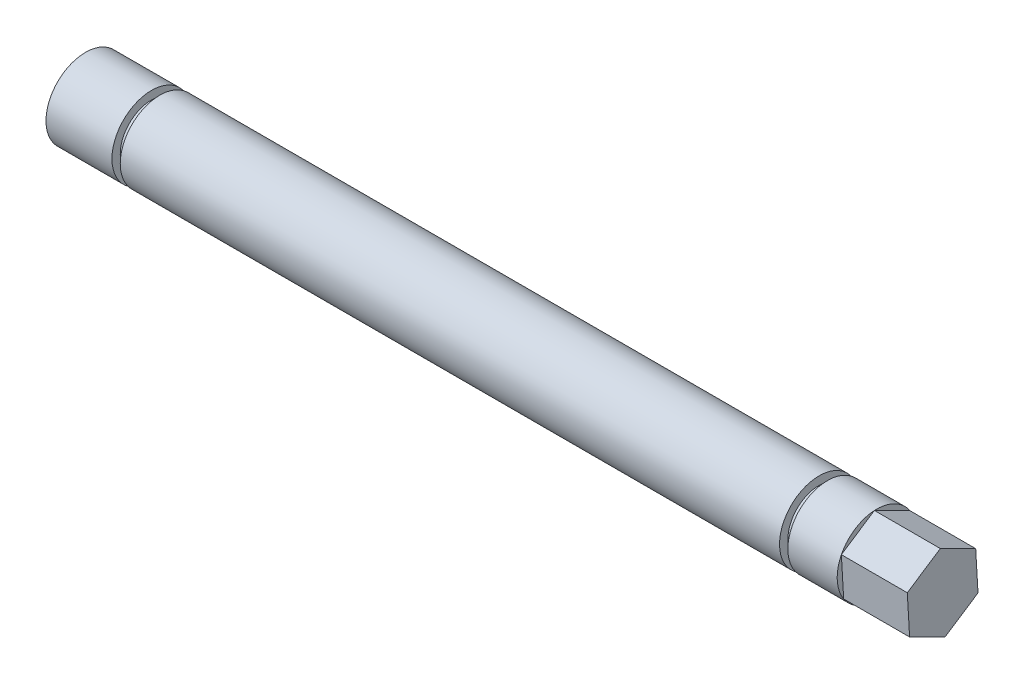
ISO-10303-21;
HEADER;
FILE_DESCRIPTION(('STEP AP214'),'2;1');
FILE_NAME('part.step','',(''),(''),'','','');
FILE_SCHEMA(('AUTOMOTIVE_DESIGN { 1 0 10303 214 1 1 1 1 }'));
ENDSEC;
DATA;
#1=APPLICATION_CONTEXT('core data for automotive mechanical design processes');
#2=APPLICATION_PROTOCOL_DEFINITION('international standard','automotive_design',2000,#1);
#3=PRODUCT_CONTEXT('',#1,'mechanical');
#4=PRODUCT('Part','Part','',(#3));
#5=PRODUCT_RELATED_PRODUCT_CATEGORY('part','',(#4));
#6=PRODUCT_DEFINITION_FORMATION('','',#4);
#7=PRODUCT_DEFINITION_CONTEXT('part definition',#1,'design');
#8=PRODUCT_DEFINITION('design','',#6,#7);
#9=PRODUCT_DEFINITION_SHAPE('','',#8);
#10=(LENGTH_UNIT() NAMED_UNIT(*) SI_UNIT(.MILLI.,.METRE.));
#11=(NAMED_UNIT(*) PLANE_ANGLE_UNIT() SI_UNIT($,.RADIAN.));
#12=(NAMED_UNIT(*) SI_UNIT($,.STERADIAN.) SOLID_ANGLE_UNIT());
#13=UNCERTAINTY_MEASURE_WITH_UNIT(LENGTH_MEASURE(1.E-05),#10,'distance_accuracy_value','');
#14=(GEOMETRIC_REPRESENTATION_CONTEXT(3) GLOBAL_UNCERTAINTY_ASSIGNED_CONTEXT((#13)) GLOBAL_UNIT_ASSIGNED_CONTEXT((#10,
#11,#12)) REPRESENTATION_CONTEXT('',''));
#15=CARTESIAN_POINT('',(0.,0.,0.));
#16=DIRECTION('',(0.,0.,1.));
#17=DIRECTION('',(1.,0.,0.));
#18=AXIS2_PLACEMENT_3D('',#15,#16,#17);
#19=CARTESIAN_POINT('',(165.1,0.,0.));
#20=DIRECTION('',(-1.,0.,0.));
#21=DIRECTION('',(0.,0.,1.));
#22=AXIS2_PLACEMENT_3D('',#19,#20,#21);
#23=CYLINDRICAL_SURFACE('',#22,7.62);
#24=CARTESIAN_POINT('',(142.9004,0.,0.));
#25=DIRECTION('',(-1.,0.,0.));
#26=DIRECTION('',(0.,0.,1.));
#27=AXIS2_PLACEMENT_3D('',#24,#25,#26);
#28=CIRCLE('',#27,7.62);
#29=CARTESIAN_POINT('',(142.9004,0.,7.62));
#30=VERTEX_POINT('',#29);
#31=EDGE_CURVE('E179',#30,#30,#28,.T.);
#32=ORIENTED_EDGE('',*,*,#31,.F.);
#33=EDGE_LOOP('',(#32));
#34=FACE_BOUND('',#33,.T.);
#35=CARTESIAN_POINT('',(152.4,0.,0.));
#36=DIRECTION('',(1.,0.,0.));
#37=DIRECTION('',(0.,0.,-1.));
#38=AXIS2_PLACEMENT_3D('',#35,#36,#37);
#39=CIRCLE('',#38,7.62);
#40=CARTESIAN_POINT('',(152.4,4.18760955818036,-6.36618615720876));
#41=VERTEX_POINT('',#40);
#42=CARTESIAN_POINT('',(152.4,7.6070837164538,0.443483179910343));
#43=VERTEX_POINT('',#42);
#44=EDGE_CURVE('E13',#41,#43,#39,.T.);
#45=ORIENTED_EDGE('',*,*,#44,.F.);
#46=CARTESIAN_POINT('',(152.4,-3.41947415827345,-6.8096693371191));
#47=VERTEX_POINT('',#46);
#48=EDGE_CURVE('E64',#47,#41,#39,.T.);
#49=ORIENTED_EDGE('',*,*,#48,.F.);
#50=CARTESIAN_POINT('',(152.4,-7.6070837164538,-0.443483179910342));
#51=VERTEX_POINT('',#50);
#52=EDGE_CURVE('E118',#51,#47,#39,.T.);
#53=ORIENTED_EDGE('',*,*,#52,.F.);
#54=CARTESIAN_POINT('',(152.4,-4.18760955818036,6.36618615720876));
#55=VERTEX_POINT('',#54);
#56=EDGE_CURVE('E157',#55,#51,#39,.T.);
#57=ORIENTED_EDGE('',*,*,#56,.F.);
#58=CARTESIAN_POINT('',(152.4,3.41947415827344,6.8096693371191));
#59=VERTEX_POINT('',#58);
#60=EDGE_CURVE('E149',#59,#55,#39,.T.);
#61=ORIENTED_EDGE('',*,*,#60,.F.);
#62=EDGE_CURVE('E58',#43,#59,#39,.T.);
#63=ORIENTED_EDGE('',*,*,#62,.F.);
#64=EDGE_LOOP('',(#45,#49,#53,#57,#61,#63));
#65=FACE_BOUND('',#64,.T.);
#66=ADVANCED_FACE('F54',(#34,#65),#23,.T.);
#67=CARTESIAN_POINT('',(0.,0.,0.));
#68=DIRECTION('',(1.,0.,0.));
#69=DIRECTION('',(0.,0.,-1.));
#70=AXIS2_PLACEMENT_3D('',#67,#68,#69);
#71=CIRCLE('',#70,7.62);
#72=CARTESIAN_POINT('',(0.,0.,-7.62));
#73=VERTEX_POINT('',#72);
#74=EDGE_CURVE('E153',#73,#73,#71,.T.);
#75=ORIENTED_EDGE('',*,*,#74,.T.);
#76=EDGE_LOOP('',(#75));
#77=FACE_BOUND('',#76,.T.);
#78=CARTESIAN_POINT('',(12.7,0.,0.));
#79=DIRECTION('',(-1.,0.,0.));
#80=DIRECTION('',(0.,0.,1.));
#81=AXIS2_PLACEMENT_3D('',#78,#79,#80);
#82=CIRCLE('',#81,7.62);
#83=CARTESIAN_POINT('',(12.7,0.,7.62));
#84=VERTEX_POINT('',#83);
#85=EDGE_CURVE('E175',#84,#84,#82,.T.);
#86=ORIENTED_EDGE('',*,*,#85,.T.);
#87=EDGE_LOOP('',(#86));
#88=FACE_BOUND('',#87,.T.);
#89=ADVANCED_FACE('F56',(#77,#88),#23,.T.);
#90=CARTESIAN_POINT('',(0.,0.,0.));
#91=DIRECTION('',(1.,0.,0.));
#92=DIRECTION('',(0.,0.,-1.));
#93=AXIS2_PLACEMENT_3D('',#90,#91,#92);
#94=PLANE('',#93);
#95=ORIENTED_EDGE('',*,*,#74,.F.);
#96=EDGE_LOOP('',(#95));
#97=FACE_BOUND('',#96,.T.);
#98=ADVANCED_FACE('F260',(#97),#94,.F.);
#99=CARTESIAN_POINT('',(12.7,7.62,0.));
#100=DIRECTION('',(1.,0.,0.));
#101=DIRECTION('',(0.,0.,-1.));
#102=AXIS2_PLACEMENT_3D('',#99,#100,#101);
#103=PLANE('',#102);
#104=CARTESIAN_POINT('',(12.7,0.,0.));
#105=DIRECTION('',(-1.,0.,0.));
#106=DIRECTION('',(0.,0.,1.));
#107=AXIS2_PLACEMENT_3D('',#104,#105,#106);
#108=CIRCLE('',#107,6.0198);
#109=CARTESIAN_POINT('',(12.7,0.,6.0198));
#110=VERTEX_POINT('',#109);
#111=EDGE_CURVE('E159',#110,#110,#108,.T.);
#112=ORIENTED_EDGE('',*,*,#111,.T.);
#113=EDGE_LOOP('',(#112));
#114=FACE_BOUND('',#113,.T.);
#115=ORIENTED_EDGE('',*,*,#85,.F.);
#116=EDGE_LOOP('',(#115));
#117=FACE_BOUND('',#116,.T.);
#118=ADVANCED_FACE('F284',(#114,#117),#103,.T.);
#119=CARTESIAN_POINT('',(0.,0.,0.));
#120=DIRECTION('',(-1.,0.,0.));
#121=DIRECTION('',(0.,0.,1.));
#122=AXIS2_PLACEMENT_3D('',#119,#120,#121);
#123=CYLINDRICAL_SURFACE('',#122,6.0198);
#124=CARTESIAN_POINT('',(14.3002,0.,0.));
#125=DIRECTION('',(-1.,0.,0.));
#126=DIRECTION('',(0.,0.,1.));
#127=AXIS2_PLACEMENT_3D('',#124,#125,#126);
#128=CIRCLE('',#127,6.0198);
#129=CARTESIAN_POINT('',(14.3002,0.,6.0198));
#130=VERTEX_POINT('',#129);
#131=EDGE_CURVE('E165',#130,#130,#128,.T.);
#132=ORIENTED_EDGE('',*,*,#131,.T.);
#133=EDGE_LOOP('',(#132));
#134=FACE_BOUND('',#133,.T.);
#135=ORIENTED_EDGE('',*,*,#111,.F.);
#136=EDGE_LOOP('',(#135));
#137=FACE_BOUND('',#136,.T.);
#138=ADVANCED_FACE('F273',(#134,#137),#123,.T.);
#139=CARTESIAN_POINT('',(14.3002,7.62,0.));
#140=DIRECTION('',(-1.,0.,0.));
#141=DIRECTION('',(0.,0.,1.));
#142=AXIS2_PLACEMENT_3D('',#139,#140,#141);
#143=PLANE('',#142);
#144=CARTESIAN_POINT('',(14.3002,0.,0.));
#145=DIRECTION('',(-1.,0.,0.));
#146=DIRECTION('',(0.,0.,1.));
#147=AXIS2_PLACEMENT_3D('',#144,#145,#146);
#148=CIRCLE('',#147,7.62);
#149=CARTESIAN_POINT('',(14.3002,0.,7.62));
#150=VERTEX_POINT('',#149);
#151=EDGE_CURVE('E171',#150,#150,#148,.T.);
#152=ORIENTED_EDGE('',*,*,#151,.T.);
#153=EDGE_LOOP('',(#152));
#154=FACE_BOUND('',#153,.T.);
#155=ORIENTED_EDGE('',*,*,#131,.F.);
#156=EDGE_LOOP('',(#155));
#157=FACE_BOUND('',#156,.T.);
#158=ADVANCED_FACE('F264',(#154,#157),#143,.T.);
#159=CARTESIAN_POINT('',(141.3002,0.,0.));
#160=DIRECTION('',(-1.,0.,0.));
#161=DIRECTION('',(0.,0.,1.));
#162=AXIS2_PLACEMENT_3D('',#159,#160,#161);
#163=CIRCLE('',#162,7.62);
#164=CARTESIAN_POINT('',(141.3002,0.,7.62));
#165=VERTEX_POINT('',#164);
#166=EDGE_CURVE('E180',#165,#165,#163,.T.);
#167=ORIENTED_EDGE('',*,*,#166,.T.);
#168=EDGE_LOOP('',(#167));
#169=FACE_BOUND('',#168,.T.);
#170=ORIENTED_EDGE('',*,*,#151,.F.);
#171=EDGE_LOOP('',(#170));
#172=FACE_BOUND('',#171,.T.);
#173=ADVANCED_FACE('F256',(#169,#172),#23,.T.);
#174=CARTESIAN_POINT('',(142.9004,0.,0.));
#175=DIRECTION('',(-1.,0.,0.));
#176=DIRECTION('',(0.,0.,1.));
#177=AXIS2_PLACEMENT_3D('',#174,#175,#176);
#178=PLANE('',#177);
#179=CARTESIAN_POINT('',(142.9004,0.,0.));
#180=DIRECTION('',(-1.,0.,0.));
#181=DIRECTION('',(0.,0.,1.));
#182=AXIS2_PLACEMENT_3D('',#179,#180,#181);
#183=CIRCLE('',#182,6.0198);
#184=CARTESIAN_POINT('',(142.9004,0.,6.0198));
#185=VERTEX_POINT('',#184);
#186=EDGE_CURVE('E184',#185,#185,#183,.T.);
#187=ORIENTED_EDGE('',*,*,#186,.F.);
#188=EDGE_LOOP('',(#187));
#189=FACE_BOUND('',#188,.T.);
#190=ORIENTED_EDGE('',*,*,#31,.T.);
#191=EDGE_LOOP('',(#190));
#192=FACE_BOUND('',#191,.T.);
#193=ADVANCED_FACE('F263',(#189,#192),#178,.T.);
#194=CARTESIAN_POINT('',(141.3002,0.,0.));
#195=DIRECTION('',(-1.,0.,0.));
#196=DIRECTION('',(0.,0.,1.));
#197=AXIS2_PLACEMENT_3D('',#194,#195,#196);
#198=PLANE('',#197);
#199=CARTESIAN_POINT('',(141.3002,0.,0.));
#200=DIRECTION('',(-1.,0.,0.));
#201=DIRECTION('',(0.,0.,1.));
#202=AXIS2_PLACEMENT_3D('',#199,#200,#201);
#203=CIRCLE('',#202,6.0198);
#204=CARTESIAN_POINT('',(141.3002,0.,6.0198));
#205=VERTEX_POINT('',#204);
#206=EDGE_CURVE('E188',#205,#205,#203,.T.);
#207=ORIENTED_EDGE('',*,*,#206,.T.);
#208=EDGE_LOOP('',(#207));
#209=FACE_BOUND('',#208,.T.);
#210=ORIENTED_EDGE('',*,*,#166,.F.);
#211=EDGE_LOOP('',(#210));
#212=FACE_BOUND('',#211,.T.);
#213=ADVANCED_FACE('F270',(#209,#212),#198,.F.);
#214=CARTESIAN_POINT('',(142.9004,0.,0.));
#215=DIRECTION('',(-1.,0.,0.));
#216=DIRECTION('',(0.,0.,1.));
#217=AXIS2_PLACEMENT_3D('',#214,#215,#216);
#218=CYLINDRICAL_SURFACE('',#217,6.0198);
#219=ORIENTED_EDGE('',*,*,#186,.T.);
#220=EDGE_LOOP('',(#219));
#221=FACE_BOUND('',#220,.T.);
#222=ORIENTED_EDGE('',*,*,#206,.F.);
#223=EDGE_LOOP('',(#222));
#224=FACE_BOUND('',#223,.T.);
#225=ADVANCED_FACE('F251',(#221,#224),#218,.T.);
#226=CARTESIAN_POINT('',(152.4,0.,0.));
#227=DIRECTION('',(1.,0.,0.));
#228=DIRECTION('',(0.,0.,-1.));
#229=AXIS2_PLACEMENT_3D('',#226,#227,#228);
#230=PLANE('',#229);
#231=ORIENTED_EDGE('',*,*,#44,.T.);
#232=DIRECTION('',(0.,0.448749889537197,0.893657393322717));
#233=VECTOR('',#232,1.);
#234=CARTESIAN_POINT('',(152.4,4.18760955818036,-6.36618615720876));
#235=LINE('',#234,#233);
#236=EDGE_CURVE('E125',#41,#43,#235,.T.);
#237=ORIENTED_EDGE('',*,*,#236,.F.);
#238=EDGE_LOOP('',(#231,#237));
#239=FACE_BOUND('',#238,.T.);
#240=ADVANCED_FACE('F136',(#239),#230,.T.);
#241=ORIENTED_EDGE('',*,*,#62,.T.);
#242=DIRECTION('',(0.,-0.549555060128657,0.835457500946032));
#243=VECTOR('',#242,1.);
#244=CARTESIAN_POINT('',(152.4,7.6070837164538,0.443483179910343));
#245=LINE('',#244,#243);
#246=EDGE_CURVE('E139',#43,#59,#245,.T.);
#247=ORIENTED_EDGE('',*,*,#246,.F.);
#248=EDGE_LOOP('',(#241,#247));
#249=FACE_BOUND('',#248,.T.);
#250=ADVANCED_FACE('F241',(#249),#230,.T.);
#251=ORIENTED_EDGE('',*,*,#60,.T.);
#252=DIRECTION('',(0.,-0.998304949665853,-0.0581998923766854));
#253=VECTOR('',#252,1.);
#254=CARTESIAN_POINT('',(152.4,3.41947415827344,6.8096693371191));
#255=LINE('',#254,#253);
#256=EDGE_CURVE('E232',#59,#55,#255,.T.);
#257=ORIENTED_EDGE('',*,*,#256,.F.);
#258=EDGE_LOOP('',(#251,#257));
#259=FACE_BOUND('',#258,.T.);
#260=ADVANCED_FACE('F243',(#259),#230,.T.);
#261=ORIENTED_EDGE('',*,*,#56,.T.);
#262=DIRECTION('',(0.,-0.448749889537197,-0.893657393322717));
#263=VECTOR('',#262,1.);
#264=CARTESIAN_POINT('',(152.4,-4.18760955818036,6.36618615720876));
#265=LINE('',#264,#263);
#266=EDGE_CURVE('E228',#55,#51,#265,.T.);
#267=ORIENTED_EDGE('',*,*,#266,.F.);
#268=EDGE_LOOP('',(#261,#267));
#269=FACE_BOUND('',#268,.T.);
#270=ADVANCED_FACE('F249',(#269),#230,.T.);
#271=ORIENTED_EDGE('',*,*,#52,.T.);
#272=DIRECTION('',(0.,0.549555060128657,-0.835457500946032));
#273=VECTOR('',#272,1.);
#274=CARTESIAN_POINT('',(152.4,-7.6070837164538,-0.443483179910342));
#275=LINE('',#274,#273);
#276=EDGE_CURVE('E71',#51,#47,#275,.T.);
#277=ORIENTED_EDGE('',*,*,#276,.F.);
#278=EDGE_LOOP('',(#271,#277));
#279=FACE_BOUND('',#278,.T.);
#280=ADVANCED_FACE('F310',(#279),#230,.T.);
#281=ORIENTED_EDGE('',*,*,#48,.T.);
#282=DIRECTION('',(0.,0.998304949665853,0.0581998923766854));
#283=VECTOR('',#282,1.);
#284=CARTESIAN_POINT('',(152.4,-3.41947415827344,-6.8096693371191));
#285=LINE('',#284,#283);
#286=EDGE_CURVE('E112',#47,#41,#285,.T.);
#287=ORIENTED_EDGE('',*,*,#286,.F.);
#288=EDGE_LOOP('',(#281,#287));
#289=FACE_BOUND('',#288,.T.);
#290=ADVANCED_FACE('F110',(#289),#230,.T.);
#291=CARTESIAN_POINT('',(152.4,-3.41947415827344,-6.8096693371191));
#292=DIRECTION('',(0.,0.0581998923766854,-0.998304949665853));
#293=DIRECTION('',(0.,0.998304949665853,0.0581998923766854));
#294=AXIS2_PLACEMENT_3D('',#291,#292,#293);
#295=PLANE('',#294);
#296=DIRECTION('',(0.,0.998304949665853,0.0581998923766854));
#297=VECTOR('',#296,1.);
#298=CARTESIAN_POINT('',(165.1,-3.41947415827344,-6.8096693371191));
#299=LINE('',#298,#297);
#300=CARTESIAN_POINT('',(165.1,-3.41947415827344,-6.8096693371191));
#301=VERTEX_POINT('',#300);
#302=CARTESIAN_POINT('',(165.1,4.18760955818036,-6.36618615720876));
#303=VERTEX_POINT('',#302);
#304=EDGE_CURVE('E223',#301,#303,#299,.T.);
#305=ORIENTED_EDGE('',*,*,#304,.F.);
#306=DIRECTION('',(1.,0.,0.));
#307=VECTOR('',#306,1.);
#308=CARTESIAN_POINT('',(152.4,-3.41947415827344,-6.8096693371191));
#309=LINE('',#308,#307);
#310=EDGE_CURVE('E142',#47,#301,#309,.T.);
#311=ORIENTED_EDGE('',*,*,#310,.F.);
#312=ORIENTED_EDGE('',*,*,#286,.T.);
#313=DIRECTION('',(1.,0.,0.));
#314=VECTOR('',#313,1.);
#315=CARTESIAN_POINT('',(152.4,4.18760955818036,-6.36618615720876));
#316=LINE('',#315,#314);
#317=EDGE_CURVE('E122',#41,#303,#316,.T.);
#318=ORIENTED_EDGE('',*,*,#317,.T.);
#319=EDGE_LOOP('',(#305,#311,#312,#318));
#320=FACE_BOUND('',#319,.T.);
#321=ADVANCED_FACE('F141',(#320),#295,.T.);
#322=CARTESIAN_POINT('',(152.4,-7.6070837164538,-0.443483179910342));
#323=DIRECTION('',(0.,-0.835457500946032,-0.549555060128657));
#324=DIRECTION('',(0.,0.549555060128657,-0.835457500946032));
#325=AXIS2_PLACEMENT_3D('',#322,#323,#324);
#326=PLANE('',#325);
#327=DIRECTION('',(0.,0.549555060128657,-0.835457500946032));
#328=VECTOR('',#327,1.);
#329=CARTESIAN_POINT('',(165.1,-7.6070837164538,-0.443483179910342));
#330=LINE('',#329,#328);
#331=CARTESIAN_POINT('',(165.1,-7.6070837164538,-0.443483179910342));
#332=VERTEX_POINT('',#331);
#333=EDGE_CURVE('E145',#332,#301,#330,.T.);
#334=ORIENTED_EDGE('',*,*,#333,.F.);
#335=DIRECTION('',(1.,0.,0.));
#336=VECTOR('',#335,1.);
#337=CARTESIAN_POINT('',(152.4,-7.6070837164538,-0.443483179910342));
#338=LINE('',#337,#336);
#339=EDGE_CURVE('E203',#51,#332,#338,.T.);
#340=ORIENTED_EDGE('',*,*,#339,.F.);
#341=ORIENTED_EDGE('',*,*,#276,.T.);
#342=ORIENTED_EDGE('',*,*,#310,.T.);
#343=EDGE_LOOP('',(#334,#340,#341,#342));
#344=FACE_BOUND('',#343,.T.);
#345=ADVANCED_FACE('F307',(#344),#326,.T.);
#346=CARTESIAN_POINT('',(152.4,-4.18760955818036,6.36618615720876));
#347=DIRECTION('',(0.,-0.893657393322717,0.448749889537197));
#348=DIRECTION('',(0.,-0.448749889537197,-0.893657393322717));
#349=AXIS2_PLACEMENT_3D('',#346,#347,#348);
#350=PLANE('',#349);
#351=DIRECTION('',(0.,-0.448749889537197,-0.893657393322717));
#352=VECTOR('',#351,1.);
#353=CARTESIAN_POINT('',(165.1,-4.18760955818036,6.36618615720876));
#354=LINE('',#353,#352);
#355=CARTESIAN_POINT('',(165.1,-4.18760955818036,6.36618615720876));
#356=VERTEX_POINT('',#355);
#357=EDGE_CURVE('E211',#356,#332,#354,.T.);
#358=ORIENTED_EDGE('',*,*,#357,.F.);
#359=DIRECTION('',(1.,0.,0.));
#360=VECTOR('',#359,1.);
#361=CARTESIAN_POINT('',(152.4,-4.18760955818036,6.36618615720876));
#362=LINE('',#361,#360);
#363=EDGE_CURVE('E200',#55,#356,#362,.T.);
#364=ORIENTED_EDGE('',*,*,#363,.F.);
#365=ORIENTED_EDGE('',*,*,#266,.T.);
#366=ORIENTED_EDGE('',*,*,#339,.T.);
#367=EDGE_LOOP('',(#358,#364,#365,#366));
#368=FACE_BOUND('',#367,.T.);
#369=ADVANCED_FACE('F313',(#368),#350,.T.);
#370=CARTESIAN_POINT('',(152.4,3.41947415827344,6.8096693371191));
#371=DIRECTION('',(0.,-0.0581998923766854,0.998304949665853));
#372=DIRECTION('',(0.,-0.998304949665853,-0.0581998923766854));
#373=AXIS2_PLACEMENT_3D('',#370,#371,#372);
#374=PLANE('',#373);
#375=DIRECTION('',(0.,-0.998304949665853,-0.0581998923766854));
#376=VECTOR('',#375,1.);
#377=CARTESIAN_POINT('',(165.1,3.41947415827344,6.8096693371191));
#378=LINE('',#377,#376);
#379=CARTESIAN_POINT('',(165.1,3.41947415827344,6.8096693371191));
#380=VERTEX_POINT('',#379);
#381=EDGE_CURVE('E215',#380,#356,#378,.T.);
#382=ORIENTED_EDGE('',*,*,#381,.F.);
#383=DIRECTION('',(1.,0.,0.));
#384=VECTOR('',#383,1.);
#385=CARTESIAN_POINT('',(152.4,3.41947415827344,6.8096693371191));
#386=LINE('',#385,#384);
#387=EDGE_CURVE('E197',#59,#380,#386,.T.);
#388=ORIENTED_EDGE('',*,*,#387,.F.);
#389=ORIENTED_EDGE('',*,*,#256,.T.);
#390=ORIENTED_EDGE('',*,*,#363,.T.);
#391=EDGE_LOOP('',(#382,#388,#389,#390));
#392=FACE_BOUND('',#391,.T.);
#393=ADVANCED_FACE('F336',(#392),#374,.T.);
#394=CARTESIAN_POINT('',(152.4,7.6070837164538,0.443483179910343));
#395=DIRECTION('',(0.,0.835457500946032,0.549555060128657));
#396=DIRECTION('',(0.,-0.549555060128657,0.835457500946032));
#397=AXIS2_PLACEMENT_3D('',#394,#395,#396);
#398=PLANE('',#397);
#399=DIRECTION('',(0.,-0.549555060128657,0.835457500946032));
#400=VECTOR('',#399,1.);
#401=CARTESIAN_POINT('',(165.1,7.6070837164538,0.443483179910343));
#402=LINE('',#401,#400);
#403=CARTESIAN_POINT('',(165.1,7.6070837164538,0.443483179910355));
#404=VERTEX_POINT('',#403);
#405=EDGE_CURVE('E79',#404,#380,#402,.T.);
#406=ORIENTED_EDGE('',*,*,#405,.F.);
#407=DIRECTION('',(1.,0.,0.));
#408=VECTOR('',#407,1.);
#409=CARTESIAN_POINT('',(152.4,7.6070837164538,0.443483179910343));
#410=LINE('',#409,#408);
#411=EDGE_CURVE('E133',#43,#404,#410,.T.);
#412=ORIENTED_EDGE('',*,*,#411,.F.);
#413=ORIENTED_EDGE('',*,*,#246,.T.);
#414=ORIENTED_EDGE('',*,*,#387,.T.);
#415=EDGE_LOOP('',(#406,#412,#413,#414));
#416=FACE_BOUND('',#415,.T.);
#417=ADVANCED_FACE('F239',(#416),#398,.T.);
#418=CARTESIAN_POINT('',(152.4,4.18760955818036,-6.36618615720876));
#419=DIRECTION('',(0.,0.893657393322717,-0.448749889537197));
#420=DIRECTION('',(0.,0.448749889537197,0.893657393322717));
#421=AXIS2_PLACEMENT_3D('',#418,#419,#420);
#422=PLANE('',#421);
#423=DIRECTION('',(0.,0.448749889537197,0.893657393322717));
#424=VECTOR('',#423,1.);
#425=CARTESIAN_POINT('',(165.1,4.18760955818036,-6.36618615720876));
#426=LINE('',#425,#424);
#427=EDGE_CURVE('E128',#303,#404,#426,.T.);
#428=ORIENTED_EDGE('',*,*,#427,.F.);
#429=ORIENTED_EDGE('',*,*,#317,.F.);
#430=ORIENTED_EDGE('',*,*,#236,.T.);
#431=ORIENTED_EDGE('',*,*,#411,.T.);
#432=EDGE_LOOP('',(#428,#429,#430,#431));
#433=FACE_BOUND('',#432,.T.);
#434=ADVANCED_FACE('F124',(#433),#422,.T.);
#435=CARTESIAN_POINT('',(165.1,0.,0.));
#436=DIRECTION('',(1.,0.,0.));
#437=DIRECTION('',(0.,0.,-1.));
#438=AXIS2_PLACEMENT_3D('',#435,#436,#437);
#439=PLANE('',#438);
#440=ORIENTED_EDGE('',*,*,#333,.T.);
#441=ORIENTED_EDGE('',*,*,#304,.T.);
#442=ORIENTED_EDGE('',*,*,#427,.T.);
#443=ORIENTED_EDGE('',*,*,#405,.T.);
#444=ORIENTED_EDGE('',*,*,#381,.T.);
#445=ORIENTED_EDGE('',*,*,#357,.T.);
#446=EDGE_LOOP('',(#440,#441,#442,#443,#444,#445));
#447=FACE_BOUND('',#446,.T.);
#448=ADVANCED_FACE('F298',(#447),#439,.T.);
#449=CLOSED_SHELL('',(#66,#89,#98,#118,#138,#158,#173,#193,#213,#225,#240,#250,#260,#270,#280,
#290,#321,#345,#369,#393,#417,#434,#448));
#450=MANIFOLD_SOLID_BREP('B2',#449);
#451=ADVANCED_BREP_SHAPE_REPRESENTATION('',(#18,#450),#14);
#452=SHAPE_DEFINITION_REPRESENTATION(#9,#451);
ENDSEC;
END-ISO-10303-21;
